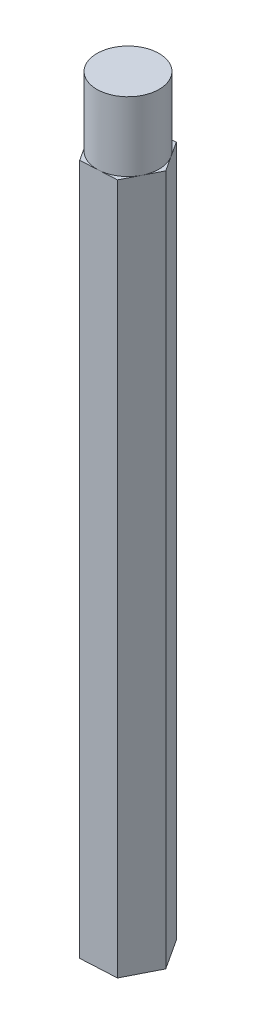
ISO-10303-21;
HEADER;
FILE_DESCRIPTION(('STEP AP214'),'2;1');
FILE_NAME('part.step','',(''),(''),'','','');
FILE_SCHEMA(('AUTOMOTIVE_DESIGN { 1 0 10303 214 1 1 1 1 }'));
ENDSEC;
DATA;
#1=APPLICATION_CONTEXT('core data for automotive mechanical design processes');
#2=APPLICATION_PROTOCOL_DEFINITION('international standard','automotive_design',2000,#1);
#3=PRODUCT_CONTEXT('',#1,'mechanical');
#4=PRODUCT('Part','Part','',(#3));
#5=PRODUCT_RELATED_PRODUCT_CATEGORY('part','',(#4));
#6=PRODUCT_DEFINITION_FORMATION('','',#4);
#7=PRODUCT_DEFINITION_CONTEXT('part definition',#1,'design');
#8=PRODUCT_DEFINITION('design','',#6,#7);
#9=PRODUCT_DEFINITION_SHAPE('','',#8);
#10=(LENGTH_UNIT() NAMED_UNIT(*) SI_UNIT(.MILLI.,.METRE.));
#11=(NAMED_UNIT(*) PLANE_ANGLE_UNIT() SI_UNIT($,.RADIAN.));
#12=(NAMED_UNIT(*) SI_UNIT($,.STERADIAN.) SOLID_ANGLE_UNIT());
#13=UNCERTAINTY_MEASURE_WITH_UNIT(LENGTH_MEASURE(1.E-05),#10,'distance_accuracy_value','');
#14=(GEOMETRIC_REPRESENTATION_CONTEXT(3) GLOBAL_UNCERTAINTY_ASSIGNED_CONTEXT((#13)) GLOBAL_UNIT_ASSIGNED_CONTEXT((#10,
#11,#12)) REPRESENTATION_CONTEXT('',''));
#15=CARTESIAN_POINT('',(0.,0.,0.));
#16=DIRECTION('',(0.,0.,1.));
#17=DIRECTION('',(1.,0.,0.));
#18=AXIS2_PLACEMENT_3D('',#15,#16,#17);
#19=CARTESIAN_POINT('',(0.,50.8,0.));
#20=DIRECTION('',(0.,1.,0.));
#21=DIRECTION('',(0.,0.,1.));
#22=AXIS2_PLACEMENT_3D('',#19,#20,#21);
#23=PLANE('',#22);
#24=DIRECTION('',(0.545079745492654,0.,0.838384202531073));
#25=VECTOR('',#24,1.);
#26=CARTESIAN_POINT('',(-1.91654628698603,50.8,1.24605229819621));
#27=LINE('',#26,#25);
#28=CARTESIAN_POINT('',(-2.63595491677397,50.8,0.139533783490444));
#29=VERTEX_POINT('',#28);
#30=CARTESIAN_POINT('',(-1.91654628698603,50.8,1.24605229819621));
#31=VERTEX_POINT('',#30);
#32=EDGE_CURVE('E157',#29,#31,#27,.T.);
#33=ORIENTED_EDGE('',*,*,#32,.T.);
#34=CARTESIAN_POINT('',(0.,50.8,0.));
#35=DIRECTION('',(0.,1.,0.));
#36=DIRECTION('',(0.,0.,1.));
#37=AXIS2_PLACEMENT_3D('',#34,#35,#36);
#38=CIRCLE('',#37,2.286);
#39=CARTESIAN_POINT('',(-2.03738608817492,50.8,-1.03675162296054));
#40=VERTEX_POINT('',#39);
#41=EDGE_CURVE('E88',#31,#40,#38,.F.);
#42=ORIENTED_EDGE('',*,*,#41,.T.);
#43=DIRECTION('',(-0.45352214477714,0.,0.891245007950532));
#44=VECTOR('',#43,1.);
#45=CARTESIAN_POINT('',(-1.43881725957587,50.8,-2.21303702941153));
#46=LINE('',#45,#44);
#47=EDGE_CURVE('E141',#40,#29,#46,.T.);
#48=ORIENTED_EDGE('',*,*,#47,.T.);
#49=EDGE_LOOP('',(#33,#42,#48));
#50=FACE_BOUND('',#49,.T.);
#51=ADVANCED_FACE('F71',(#50),#23,.T.);
#52=CARTESIAN_POINT('',(-1.43881725957587,50.8,-2.21303702941153));
#53=VERTEX_POINT('',#52);
#54=EDGE_CURVE('E158',#53,#40,#46,.T.);
#55=ORIENTED_EDGE('',*,*,#54,.T.);
#56=CARTESIAN_POINT('',(-0.120839801188882,50.8,-2.28280392115675));
#57=VERTEX_POINT('',#56);
#58=EDGE_CURVE('E191',#40,#57,#38,.F.);
#59=ORIENTED_EDGE('',*,*,#58,.T.);
#60=DIRECTION('',(-0.998601890269794,0.,0.0528608054194586));
#61=VECTOR('',#60,1.);
#62=CARTESIAN_POINT('',(-0.120839801188882,50.8,-2.28280392115675));
#63=LINE('',#62,#61);
#64=EDGE_CURVE('E184',#57,#53,#63,.T.);
#65=ORIENTED_EDGE('',*,*,#64,.T.);
#66=EDGE_LOOP('',(#55,#59,#65));
#67=FACE_BOUND('',#66,.T.);
#68=ADVANCED_FACE('F212',(#67),#23,.T.);
#69=CARTESIAN_POINT('',(1.1971376571981,50.8,-2.35257081290197));
#70=VERTEX_POINT('',#69);
#71=EDGE_CURVE('E181',#70,#57,#63,.T.);
#72=ORIENTED_EDGE('',*,*,#71,.T.);
#73=CARTESIAN_POINT('',(1.91654628698603,50.8,-1.24605229819621));
#74=VERTEX_POINT('',#73);
#75=EDGE_CURVE('E420',#57,#74,#38,.F.);
#76=ORIENTED_EDGE('',*,*,#75,.T.);
#77=DIRECTION('',(-0.545079745492655,0.,-0.838384202531073));
#78=VECTOR('',#77,1.);
#79=CARTESIAN_POINT('',(1.91654628698603,50.8,-1.24605229819621));
#80=LINE('',#79,#78);
#81=EDGE_CURVE('E188',#74,#70,#80,.T.);
#82=ORIENTED_EDGE('',*,*,#81,.T.);
#83=EDGE_LOOP('',(#72,#76,#82));
#84=FACE_BOUND('',#83,.T.);
#85=ADVANCED_FACE('F217',(#84),#23,.T.);
#86=CARTESIAN_POINT('',(2.63595491677397,50.8,-0.139533783490444));
#87=VERTEX_POINT('',#86);
#88=EDGE_CURVE('E185',#87,#74,#80,.T.);
#89=ORIENTED_EDGE('',*,*,#88,.T.);
#90=CARTESIAN_POINT('',(2.03738608817492,50.8,1.03675162296054));
#91=VERTEX_POINT('',#90);
#92=EDGE_CURVE('E443',#74,#91,#38,.F.);
#93=ORIENTED_EDGE('',*,*,#92,.T.);
#94=DIRECTION('',(0.45352214477714,0.,-0.891245007950532));
#95=VECTOR('',#94,1.);
#96=CARTESIAN_POINT('',(2.03738608817491,50.8,1.03675162296054));
#97=LINE('',#96,#95);
#98=EDGE_CURVE('E171',#91,#87,#97,.T.);
#99=ORIENTED_EDGE('',*,*,#98,.T.);
#100=EDGE_LOOP('',(#89,#93,#99));
#101=FACE_BOUND('',#100,.T.);
#102=ADVANCED_FACE('F231',(#101),#23,.T.);
#103=CARTESIAN_POINT('',(1.43881725957586,50.8,2.21303702941153));
#104=VERTEX_POINT('',#103);
#105=EDGE_CURVE('E189',#104,#91,#97,.T.);
#106=ORIENTED_EDGE('',*,*,#105,.T.);
#107=CARTESIAN_POINT('',(0.120839801188882,50.8,2.28280392115675));
#108=VERTEX_POINT('',#107);
#109=EDGE_CURVE('E442',#91,#108,#38,.F.);
#110=ORIENTED_EDGE('',*,*,#109,.T.);
#111=DIRECTION('',(0.998601890269794,0.,-0.0528608054194586));
#112=VECTOR('',#111,1.);
#113=CARTESIAN_POINT('',(0.120839801188882,50.8,2.28280392115675));
#114=LINE('',#113,#112);
#115=EDGE_CURVE('E97',#108,#104,#114,.T.);
#116=ORIENTED_EDGE('',*,*,#115,.T.);
#117=EDGE_LOOP('',(#106,#110,#116));
#118=FACE_BOUND('',#117,.T.);
#119=ADVANCED_FACE('F223',(#118),#23,.T.);
#120=CARTESIAN_POINT('',(0.,0.,0.));
#121=DIRECTION('',(0.,1.,0.));
#122=DIRECTION('',(0.,0.,1.));
#123=AXIS2_PLACEMENT_3D('',#120,#121,#122);
#124=PLANE('',#123);
#125=DIRECTION('',(0.998601890269794,0.,-0.0528608054194586));
#126=VECTOR('',#125,1.);
#127=CARTESIAN_POINT('',(0.120839801188882,0.,2.28280392115675));
#128=LINE('',#127,#126);
#129=CARTESIAN_POINT('',(-1.1971376571981,0.,2.35257081290197));
#130=VERTEX_POINT('',#129);
#131=CARTESIAN_POINT('',(1.43881725957586,0.,2.21303702941153));
#132=VERTEX_POINT('',#131);
#133=EDGE_CURVE('E147',#130,#132,#128,.T.);
#134=ORIENTED_EDGE('',*,*,#133,.F.);
#135=DIRECTION('',(0.545079745492654,0.,0.838384202531073));
#136=VECTOR('',#135,1.);
#137=CARTESIAN_POINT('',(-1.91654628698603,0.,1.24605229819621));
#138=LINE('',#137,#136);
#139=CARTESIAN_POINT('',(-2.63595491677397,0.,0.139533783490444));
#140=VERTEX_POINT('',#139);
#141=EDGE_CURVE('E144',#140,#130,#138,.T.);
#142=ORIENTED_EDGE('',*,*,#141,.F.);
#143=DIRECTION('',(-0.45352214477714,0.,0.891245007950532));
#144=VECTOR('',#143,1.);
#145=CARTESIAN_POINT('',(-1.43881725957587,0.,-2.21303702941153));
#146=LINE('',#145,#144);
#147=CARTESIAN_POINT('',(-1.43881725957587,0.,-2.21303702941153));
#148=VERTEX_POINT('',#147);
#149=EDGE_CURVE('E132',#148,#140,#146,.T.);
#150=ORIENTED_EDGE('',*,*,#149,.F.);
#151=DIRECTION('',(-0.998601890269794,0.,0.0528608054194586));
#152=VECTOR('',#151,1.);
#153=CARTESIAN_POINT('',(-0.120839801188882,0.,-2.28280392115675));
#154=LINE('',#153,#152);
#155=CARTESIAN_POINT('',(1.1971376571981,0.,-2.35257081290197));
#156=VERTEX_POINT('',#155);
#157=EDGE_CURVE('E151',#156,#148,#154,.T.);
#158=ORIENTED_EDGE('',*,*,#157,.F.);
#159=DIRECTION('',(-0.545079745492655,0.,-0.838384202531073));
#160=VECTOR('',#159,1.);
#161=CARTESIAN_POINT('',(1.91654628698603,0.,-1.24605229819621));
#162=LINE('',#161,#160);
#163=CARTESIAN_POINT('',(2.63595491677397,0.,-0.139533783490444));
#164=VERTEX_POINT('',#163);
#165=EDGE_CURVE('E174',#164,#156,#162,.T.);
#166=ORIENTED_EDGE('',*,*,#165,.F.);
#167=DIRECTION('',(0.45352214477714,0.,-0.891245007950532));
#168=VECTOR('',#167,1.);
#169=CARTESIAN_POINT('',(2.03738608817491,0.,1.03675162296054));
#170=LINE('',#169,#168);
#171=EDGE_CURVE('E159',#132,#164,#170,.T.);
#172=ORIENTED_EDGE('',*,*,#171,.F.);
#173=EDGE_LOOP('',(#134,#142,#150,#158,#166,#172));
#174=FACE_BOUND('',#173,.T.);
#175=ADVANCED_FACE('F145',(#174),#124,.F.);
#176=CARTESIAN_POINT('',(2.03738608817491,50.8,1.03675162296054));
#177=DIRECTION('',(-0.891245007950532,0.,-0.45352214477714));
#178=DIRECTION('',(-0.45352214477714,0.,0.891245007950532));
#179=AXIS2_PLACEMENT_3D('',#176,#177,#178);
#180=PLANE('',#179);
#181=ORIENTED_EDGE('',*,*,#171,.T.);
#182=DIRECTION('',(0.,-1.,0.));
#183=VECTOR('',#182,1.);
#184=CARTESIAN_POINT('',(2.63595491677397,50.8,-0.139533783490444));
#185=LINE('',#184,#183);
#186=EDGE_CURVE('E12',#87,#164,#185,.T.);
#187=ORIENTED_EDGE('',*,*,#186,.F.);
#188=ORIENTED_EDGE('',*,*,#98,.F.);
#189=ORIENTED_EDGE('',*,*,#105,.F.);
#190=DIRECTION('',(0.,-1.,0.));
#191=VECTOR('',#190,1.);
#192=CARTESIAN_POINT('',(1.43881725957586,50.8,2.21303702941153));
#193=LINE('',#192,#191);
#194=EDGE_CURVE('E167',#104,#132,#193,.T.);
#195=ORIENTED_EDGE('',*,*,#194,.T.);
#196=EDGE_LOOP('',(#181,#187,#188,#189,#195));
#197=FACE_BOUND('',#196,.T.);
#198=ADVANCED_FACE('F232',(#197),#180,.F.);
#199=CARTESIAN_POINT('',(0.120839801188882,50.8,2.28280392115675));
#200=DIRECTION('',(-0.0528608054194586,0.,-0.998601890269794));
#201=DIRECTION('',(-0.998601890269794,0.,0.0528608054194586));
#202=AXIS2_PLACEMENT_3D('',#199,#200,#201);
#203=PLANE('',#202);
#204=ORIENTED_EDGE('',*,*,#133,.T.);
#205=ORIENTED_EDGE('',*,*,#194,.F.);
#206=ORIENTED_EDGE('',*,*,#115,.F.);
#207=CARTESIAN_POINT('',(-1.1971376571981,50.8,2.35257081290197));
#208=VERTEX_POINT('',#207);
#209=EDGE_CURVE('E170',#208,#108,#114,.T.);
#210=ORIENTED_EDGE('',*,*,#209,.F.);
#211=DIRECTION('',(0.,-1.,0.));
#212=VECTOR('',#211,1.);
#213=CARTESIAN_POINT('',(-1.1971376571981,50.8,2.35257081290197));
#214=LINE('',#213,#212);
#215=EDGE_CURVE('E165',#208,#130,#214,.T.);
#216=ORIENTED_EDGE('',*,*,#215,.T.);
#217=EDGE_LOOP('',(#204,#205,#206,#210,#216));
#218=FACE_BOUND('',#217,.T.);
#219=ADVANCED_FACE('F237',(#218),#203,.F.);
#220=CARTESIAN_POINT('',(-1.91654628698603,50.8,1.24605229819621));
#221=DIRECTION('',(0.838384202531073,0.,-0.545079745492654));
#222=DIRECTION('',(-0.545079745492654,0.,-0.838384202531073));
#223=AXIS2_PLACEMENT_3D('',#220,#221,#222);
#224=PLANE('',#223);
#225=ORIENTED_EDGE('',*,*,#141,.T.);
#226=ORIENTED_EDGE('',*,*,#215,.F.);
#227=EDGE_CURVE('E180',#31,#208,#27,.T.);
#228=ORIENTED_EDGE('',*,*,#227,.F.);
#229=ORIENTED_EDGE('',*,*,#32,.F.);
#230=DIRECTION('',(0.,-1.,0.));
#231=VECTOR('',#230,1.);
#232=CARTESIAN_POINT('',(-2.63595491677397,50.8,0.139533783490444));
#233=LINE('',#232,#231);
#234=EDGE_CURVE('E136',#29,#140,#233,.T.);
#235=ORIENTED_EDGE('',*,*,#234,.T.);
#236=EDGE_LOOP('',(#225,#226,#228,#229,#235));
#237=FACE_BOUND('',#236,.T.);
#238=ADVANCED_FACE('F154',(#237),#224,.F.);
#239=CARTESIAN_POINT('',(-0.120839801188882,50.8,-2.28280392115675));
#240=DIRECTION('',(0.0528608054194586,0.,0.998601890269794));
#241=DIRECTION('',(0.998601890269794,0.,-0.0528608054194586));
#242=AXIS2_PLACEMENT_3D('',#239,#240,#241);
#243=PLANE('',#242);
#244=ORIENTED_EDGE('',*,*,#157,.T.);
#245=DIRECTION('',(0.,-1.,0.));
#246=VECTOR('',#245,1.);
#247=CARTESIAN_POINT('',(-1.43881725957587,50.8,-2.21303702941153));
#248=LINE('',#247,#246);
#249=EDGE_CURVE('E75',#53,#148,#248,.T.);
#250=ORIENTED_EDGE('',*,*,#249,.F.);
#251=ORIENTED_EDGE('',*,*,#64,.F.);
#252=ORIENTED_EDGE('',*,*,#71,.F.);
#253=DIRECTION('',(0.,-1.,0.));
#254=VECTOR('',#253,1.);
#255=CARTESIAN_POINT('',(1.1971376571981,50.8,-2.35257081290197));
#256=LINE('',#255,#254);
#257=EDGE_CURVE('E80',#70,#156,#256,.T.);
#258=ORIENTED_EDGE('',*,*,#257,.T.);
#259=EDGE_LOOP('',(#244,#250,#251,#252,#258));
#260=FACE_BOUND('',#259,.T.);
#261=ADVANCED_FACE('F227',(#260),#243,.F.);
#262=CARTESIAN_POINT('',(1.91654628698603,50.8,-1.24605229819621));
#263=DIRECTION('',(-0.838384202531073,0.,0.545079745492655));
#264=DIRECTION('',(0.545079745492655,0.,0.838384202531073));
#265=AXIS2_PLACEMENT_3D('',#262,#263,#264);
#266=PLANE('',#265);
#267=ORIENTED_EDGE('',*,*,#165,.T.);
#268=ORIENTED_EDGE('',*,*,#257,.F.);
#269=ORIENTED_EDGE('',*,*,#81,.F.);
#270=ORIENTED_EDGE('',*,*,#88,.F.);
#271=ORIENTED_EDGE('',*,*,#186,.T.);
#272=EDGE_LOOP('',(#267,#268,#269,#270,#271));
#273=FACE_BOUND('',#272,.T.);
#274=ADVANCED_FACE('F221',(#273),#266,.F.);
#275=ORIENTED_EDGE('',*,*,#209,.T.);
#276=EDGE_CURVE('E194',#108,#31,#38,.F.);
#277=ORIENTED_EDGE('',*,*,#276,.T.);
#278=ORIENTED_EDGE('',*,*,#227,.T.);
#279=EDGE_LOOP('',(#275,#277,#278));
#280=FACE_BOUND('',#279,.T.);
#281=ADVANCED_FACE('F209',(#280),#23,.T.);
#282=CARTESIAN_POINT('',(-1.43881725957587,50.8,-2.21303702941153));
#283=DIRECTION('',(0.891245007950532,0.,0.45352214477714));
#284=DIRECTION('',(0.45352214477714,0.,-0.891245007950532));
#285=AXIS2_PLACEMENT_3D('',#282,#283,#284);
#286=PLANE('',#285);
#287=ORIENTED_EDGE('',*,*,#149,.T.);
#288=ORIENTED_EDGE('',*,*,#234,.F.);
#289=ORIENTED_EDGE('',*,*,#47,.F.);
#290=ORIENTED_EDGE('',*,*,#54,.F.);
#291=ORIENTED_EDGE('',*,*,#249,.T.);
#292=EDGE_LOOP('',(#287,#288,#289,#290,#291));
#293=FACE_BOUND('',#292,.T.);
#294=ADVANCED_FACE('F73',(#293),#286,.F.);
#295=CARTESIAN_POINT('',(0.,55.88,0.));
#296=DIRECTION('',(0.,-1.,0.));
#297=DIRECTION('',(0.,0.,-1.));
#298=AXIS2_PLACEMENT_3D('',#295,#296,#297);
#299=CYLINDRICAL_SURFACE('',#298,2.286);
#300=ORIENTED_EDGE('',*,*,#41,.F.);
#301=ORIENTED_EDGE('',*,*,#276,.F.);
#302=ORIENTED_EDGE('',*,*,#109,.F.);
#303=ORIENTED_EDGE('',*,*,#92,.F.);
#304=ORIENTED_EDGE('',*,*,#75,.F.);
#305=ORIENTED_EDGE('',*,*,#58,.F.);
#306=EDGE_LOOP('',(#300,#301,#302,#303,#304,#305));
#307=FACE_BOUND('',#306,.T.);
#308=CARTESIAN_POINT('',(0.,55.88,0.));
#309=DIRECTION('',(0.,1.,0.));
#310=DIRECTION('',(0.,0.,1.));
#311=AXIS2_PLACEMENT_3D('',#308,#309,#310);
#312=CIRCLE('',#311,2.286);
#313=CARTESIAN_POINT('',(0.,55.88,2.286));
#314=VERTEX_POINT('',#313);
#315=EDGE_CURVE('E195',#314,#314,#312,.T.);
#316=ORIENTED_EDGE('',*,*,#315,.F.);
#317=EDGE_LOOP('',(#316));
#318=FACE_BOUND('',#317,.T.);
#319=ADVANCED_FACE('F201',(#307,#318),#299,.T.);
#320=CARTESIAN_POINT('',(0.,55.88,0.));
#321=DIRECTION('',(0.,1.,0.));
#322=DIRECTION('',(0.,0.,1.));
#323=AXIS2_PLACEMENT_3D('',#320,#321,#322);
#324=PLANE('',#323);
#325=ORIENTED_EDGE('',*,*,#315,.T.);
#326=EDGE_LOOP('',(#325));
#327=FACE_BOUND('',#326,.T.);
#328=ADVANCED_FACE('F199',(#327),#324,.T.);
#329=CLOSED_SHELL('',(#51,#68,#85,#102,#119,#175,#198,#219,#238,#261,#274,#281,#294,#319,#328));
#330=MANIFOLD_SOLID_BREP('B2',#329);
#331=ADVANCED_BREP_SHAPE_REPRESENTATION('',(#18,#330),#14);
#332=SHAPE_DEFINITION_REPRESENTATION(#9,#331);
ENDSEC;
END-ISO-10303-21;
